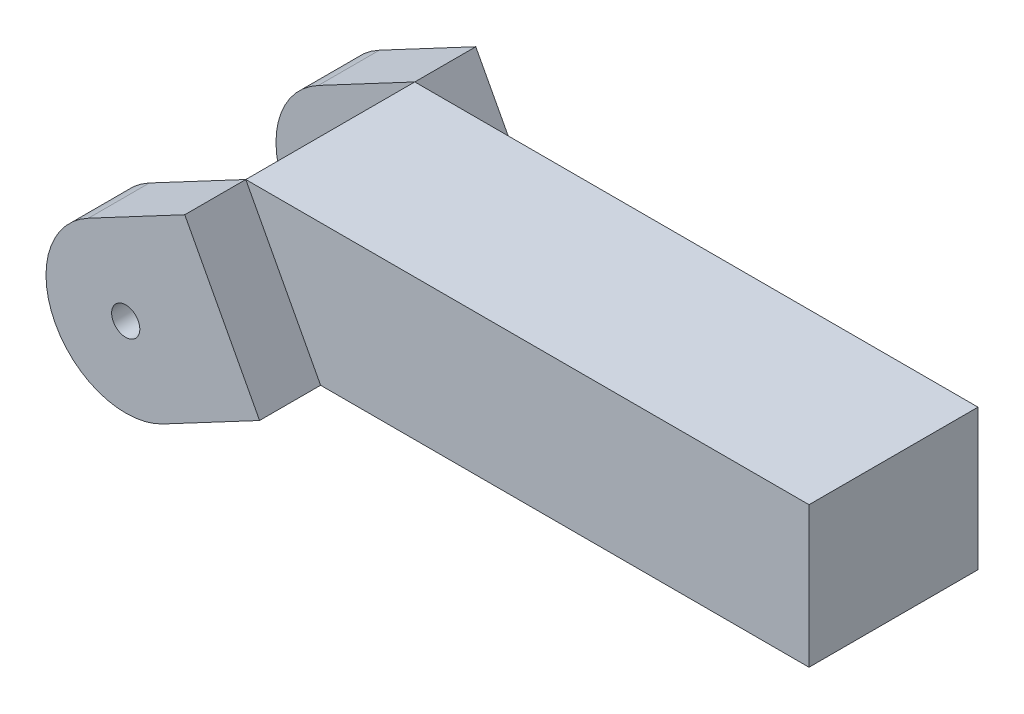
ISO-10303-21;
HEADER;
FILE_DESCRIPTION(('STEP AP214'),'2;1');
FILE_NAME('part.step','',(''),(''),'','','');
FILE_SCHEMA(('AUTOMOTIVE_DESIGN { 1 0 10303 214 1 1 1 1 }'));
ENDSEC;
DATA;
#1=APPLICATION_CONTEXT('core data for automotive mechanical design processes');
#2=APPLICATION_PROTOCOL_DEFINITION('international standard','automotive_design',2000,#1);
#3=PRODUCT_CONTEXT('',#1,'mechanical');
#4=PRODUCT('Part','Part','',(#3));
#5=PRODUCT_RELATED_PRODUCT_CATEGORY('part','',(#4));
#6=PRODUCT_DEFINITION_FORMATION('','',#4);
#7=PRODUCT_DEFINITION_CONTEXT('part definition',#1,'design');
#8=PRODUCT_DEFINITION('design','',#6,#7);
#9=PRODUCT_DEFINITION_SHAPE('','',#8);
#10=(LENGTH_UNIT() NAMED_UNIT(*) SI_UNIT(.MILLI.,.METRE.));
#11=(NAMED_UNIT(*) PLANE_ANGLE_UNIT() SI_UNIT($,.RADIAN.));
#12=(NAMED_UNIT(*) SI_UNIT($,.STERADIAN.) SOLID_ANGLE_UNIT());
#13=UNCERTAINTY_MEASURE_WITH_UNIT(LENGTH_MEASURE(1.E-05),#10,'distance_accuracy_value','');
#14=(GEOMETRIC_REPRESENTATION_CONTEXT(3) GLOBAL_UNCERTAINTY_ASSIGNED_CONTEXT((#13)) GLOBAL_UNIT_ASSIGNED_CONTEXT((#10,
#11,#12)) REPRESENTATION_CONTEXT('',''));
#15=CARTESIAN_POINT('',(0.,0.,0.));
#16=DIRECTION('',(0.,0.,1.));
#17=DIRECTION('',(1.,0.,0.));
#18=AXIS2_PLACEMENT_3D('',#15,#16,#17);
#19=CARTESIAN_POINT('',(0.,0.,36.));
#20=DIRECTION('',(0.,0.,-1.));
#21=DIRECTION('',(1.,0.,0.));
#22=AXIS2_PLACEMENT_3D('',#19,#20,#21);
#23=PLANE('',#22);
#24=CARTESIAN_POINT('',(-72.5807082768003,-10.915949030261,36.));
#25=DIRECTION('',(0.,0.,1.));
#26=DIRECTION('',(1.,0.,0.));
#27=AXIS2_PLACEMENT_3D('',#24,#25,#26);
#28=CIRCLE('',#27,3.00000000000001);
#29=CARTESIAN_POINT('',(-69.5807082768003,-10.915949030261,36.));
#30=VERTEX_POINT('',#29);
#31=EDGE_CURVE('E114',#30,#30,#28,.F.);
#32=ORIENTED_EDGE('',*,*,#31,.F.);
#33=EDGE_LOOP('',(#32));
#34=FACE_BOUND('',#33,.T.);
#35=DIRECTION('',(-0.883127916837894,-0.46913226546632,0.));
#36=VECTOR('',#35,1.);
#37=CARTESIAN_POINT('',(-44.0635000936416,-15.,36.));
#38=LINE('',#37,#36);
#39=CARTESIAN_POINT('',(-44.0635000936416,-15.,36.));
#40=VERTEX_POINT('',#39);
#41=CARTESIAN_POINT('',(-64.6124583236211,-25.915949030261,36.));
#42=VERTEX_POINT('',#41);
#43=EDGE_CURVE('E111',#40,#42,#38,.T.);
#44=ORIENTED_EDGE('',*,*,#43,.T.);
#45=CARTESIAN_POINT('',(-72.5807082768003,-10.915949030261,36.));
#46=DIRECTION('',(0.,0.,1.));
#47=DIRECTION('',(1.,0.,0.));
#48=AXIS2_PLACEMENT_3D('',#45,#46,#47);
#49=CIRCLE('',#48,16.9850819049053);
#50=CARTESIAN_POINT('',(-80.5489582299795,4.08405096973898,36.));
#51=VERTEX_POINT('',#50);
#52=EDGE_CURVE('E105',#42,#51,#49,.F.);
#53=ORIENTED_EDGE('',*,*,#52,.T.);
#54=DIRECTION('',(0.883127916837894,0.46913226546632,0.));
#55=VECTOR('',#54,1.);
#56=CARTESIAN_POINT('',(-60.,15.,36.));
#57=LINE('',#56,#55);
#58=CARTESIAN_POINT('',(-60.,15.,36.));
#59=VERTEX_POINT('',#58);
#60=EDGE_CURVE('E103',#51,#59,#57,.T.);
#61=ORIENTED_EDGE('',*,*,#60,.T.);
#62=DIRECTION('',(0.46913226546632,-0.883127916837894,0.));
#63=VECTOR('',#62,1.);
#64=CARTESIAN_POINT('',(-60.,15.,36.));
#65=LINE('',#64,#63);
#66=EDGE_CURVE('E12',#59,#40,#65,.T.);
#67=ORIENTED_EDGE('',*,*,#66,.T.);
#68=EDGE_LOOP('',(#44,#53,#61,#67));
#69=FACE_BOUND('',#68,.T.);
#70=ADVANCED_FACE('F45',(#34,#69),#23,.T.);
#71=CARTESIAN_POINT('',(-60.,15.,-26.5376435321832));
#72=DIRECTION('',(-0.46913226546632,0.883127916837894,0.));
#73=DIRECTION('',(-0.883127916837894,-0.46913226546632,0.));
#74=AXIS2_PLACEMENT_3D('',#71,#72,#73);
#75=PLANE('',#74);
#76=DIRECTION('',(0.,0.,1.));
#77=VECTOR('',#76,1.);
#78=CARTESIAN_POINT('',(-80.5489582299795,4.08405096973897,-26.5376435321832));
#79=LINE('',#78,#77);
#80=CARTESIAN_POINT('',(-80.5489582299795,4.08405096973897,49.));
#81=VERTEX_POINT('',#80);
#82=EDGE_CURVE('E91',#51,#81,#79,.T.);
#83=ORIENTED_EDGE('',*,*,#82,.T.);
#84=DIRECTION('',(0.883127916837894,0.46913226546632,0.));
#85=VECTOR('',#84,1.);
#86=CARTESIAN_POINT('',(-60.,15.,49.));
#87=LINE('',#86,#85);
#88=CARTESIAN_POINT('',(-60.,15.,49.));
#89=VERTEX_POINT('',#88);
#90=EDGE_CURVE('E97',#81,#89,#87,.T.);
#91=ORIENTED_EDGE('',*,*,#90,.T.);
#92=DIRECTION('',(0.,0.,1.));
#93=VECTOR('',#92,1.);
#94=CARTESIAN_POINT('',(-60.,15.,-26.5376435321832));
#95=LINE('',#94,#93);
#96=EDGE_CURVE('E120',#59,#89,#95,.T.);
#97=ORIENTED_EDGE('',*,*,#96,.F.);
#98=ORIENTED_EDGE('',*,*,#60,.F.);
#99=EDGE_LOOP('',(#83,#91,#97,#98));
#100=FACE_BOUND('',#99,.T.);
#101=ADVANCED_FACE('F102',(#100),#75,.T.);
#102=CARTESIAN_POINT('',(-72.5807082768003,-10.915949030261,-26.5376435321832));
#103=DIRECTION('',(0.,0.,1.));
#104=DIRECTION('',(-1.,0.,0.));
#105=AXIS2_PLACEMENT_3D('',#102,#103,#104);
#106=CYLINDRICAL_SURFACE('',#105,16.9850819049053);
#107=DIRECTION('',(0.,0.,1.));
#108=VECTOR('',#107,1.);
#109=CARTESIAN_POINT('',(-64.6124583236211,-25.915949030261,-26.5376435321832));
#110=LINE('',#109,#108);
#111=CARTESIAN_POINT('',(-64.6124583236211,-25.915949030261,49.));
#112=VERTEX_POINT('',#111);
#113=EDGE_CURVE('E93',#42,#112,#110,.T.);
#114=ORIENTED_EDGE('',*,*,#113,.T.);
#115=CARTESIAN_POINT('',(-72.5807082768003,-10.915949030261,49.));
#116=DIRECTION('',(0.,0.,-1.));
#117=DIRECTION('',(-1.,0.,0.));
#118=AXIS2_PLACEMENT_3D('',#115,#116,#117);
#119=CIRCLE('',#118,16.9850819049053);
#120=EDGE_CURVE('E86',#112,#81,#119,.T.);
#121=ORIENTED_EDGE('',*,*,#120,.T.);
#122=ORIENTED_EDGE('',*,*,#82,.F.);
#123=ORIENTED_EDGE('',*,*,#52,.F.);
#124=EDGE_LOOP('',(#114,#121,#122,#123));
#125=FACE_BOUND('',#124,.T.);
#126=ADVANCED_FACE('F88',(#125),#106,.T.);
#127=CARTESIAN_POINT('',(-44.0635000936416,-15.,-26.5376435321832));
#128=DIRECTION('',(0.46913226546632,-0.883127916837894,0.));
#129=DIRECTION('',(0.883127916837894,0.46913226546632,0.));
#130=AXIS2_PLACEMENT_3D('',#127,#128,#129);
#131=PLANE('',#130);
#132=DIRECTION('',(0.,0.,1.));
#133=VECTOR('',#132,1.);
#134=CARTESIAN_POINT('',(-44.0635000936416,-15.,-26.5376435321832));
#135=LINE('',#134,#133);
#136=CARTESIAN_POINT('',(-44.0635000936416,-15.,49.));
#137=VERTEX_POINT('',#136);
#138=EDGE_CURVE('E95',#40,#137,#135,.T.);
#139=ORIENTED_EDGE('',*,*,#138,.T.);
#140=DIRECTION('',(-0.883127916837894,-0.46913226546632,0.));
#141=VECTOR('',#140,1.);
#142=CARTESIAN_POINT('',(-44.0635000936416,-15.,49.));
#143=LINE('',#142,#141);
#144=EDGE_CURVE('E81',#137,#112,#143,.T.);
#145=ORIENTED_EDGE('',*,*,#144,.T.);
#146=ORIENTED_EDGE('',*,*,#113,.F.);
#147=ORIENTED_EDGE('',*,*,#43,.F.);
#148=EDGE_LOOP('',(#139,#145,#146,#147));
#149=FACE_BOUND('',#148,.T.);
#150=ADVANCED_FACE('F123',(#149),#131,.T.);
#151=CARTESIAN_POINT('',(-60.,15.,-26.5376435321832));
#152=DIRECTION('',(0.883127916837894,0.46913226546632,0.));
#153=DIRECTION('',(-0.46913226546632,0.883127916837894,0.));
#154=AXIS2_PLACEMENT_3D('',#151,#152,#153);
#155=PLANE('',#154);
#156=ORIENTED_EDGE('',*,*,#96,.T.);
#157=DIRECTION('',(0.46913226546632,-0.883127916837894,0.));
#158=VECTOR('',#157,1.);
#159=CARTESIAN_POINT('',(-60.,15.,49.));
#160=LINE('',#159,#158);
#161=EDGE_CURVE('E98',#89,#137,#160,.T.);
#162=ORIENTED_EDGE('',*,*,#161,.T.);
#163=ORIENTED_EDGE('',*,*,#138,.F.);
#164=ORIENTED_EDGE('',*,*,#66,.F.);
#165=EDGE_LOOP('',(#156,#162,#163,#164));
#166=FACE_BOUND('',#165,.T.);
#167=ADVANCED_FACE('F125',(#166),#155,.T.);
#168=CARTESIAN_POINT('',(-72.5807082768003,-10.915949030261,-26.5376435321832));
#169=DIRECTION('',(0.,0.,1.));
#170=DIRECTION('',(-1.,0.,0.));
#171=AXIS2_PLACEMENT_3D('',#168,#169,#170);
#172=CYLINDRICAL_SURFACE('',#171,3.00000000000001);
#173=CARTESIAN_POINT('',(-72.5807082768003,-10.915949030261,49.));
#174=DIRECTION('',(0.,0.,-1.));
#175=DIRECTION('',(-1.,0.,0.));
#176=AXIS2_PLACEMENT_3D('',#173,#174,#175);
#177=CIRCLE('',#176,3.00000000000001);
#178=CARTESIAN_POINT('',(-75.5807082768003,-10.915949030261,49.));
#179=VERTEX_POINT('',#178);
#180=EDGE_CURVE('E54',#179,#179,#177,.T.);
#181=ORIENTED_EDGE('',*,*,#180,.F.);
#182=EDGE_LOOP('',(#181));
#183=FACE_BOUND('',#182,.T.);
#184=ORIENTED_EDGE('',*,*,#31,.T.);
#185=EDGE_LOOP('',(#184));
#186=FACE_BOUND('',#185,.T.);
#187=ADVANCED_FACE('F135',(#183,#186),#172,.F.);
#188=CARTESIAN_POINT('',(-72.5807082768003,-10.915949030261,49.));
#189=DIRECTION('',(0.,0.,1.));
#190=DIRECTION('',(-1.,0.,0.));
#191=AXIS2_PLACEMENT_3D('',#188,#189,#190);
#192=PLANE('',#191);
#193=ORIENTED_EDGE('',*,*,#180,.T.);
#194=EDGE_LOOP('',(#193));
#195=FACE_BOUND('',#194,.T.);
#196=ORIENTED_EDGE('',*,*,#90,.F.);
#197=ORIENTED_EDGE('',*,*,#120,.F.);
#198=ORIENTED_EDGE('',*,*,#144,.F.);
#199=ORIENTED_EDGE('',*,*,#161,.F.);
#200=EDGE_LOOP('',(#196,#197,#198,#199));
#201=FACE_BOUND('',#200,.T.);
#202=ADVANCED_FACE('F47',(#195,#201),#192,.T.);
#203=CLOSED_SHELL('',(#70,#101,#126,#150,#167,#187,#202));
#204=MANIFOLD_SOLID_BREP('B2',#203);
#205=CARTESIAN_POINT('',(0.,0.,0.));
#206=DIRECTION('',(0.,0.,1.));
#207=DIRECTION('',(1.,0.,0.));
#208=AXIS2_PLACEMENT_3D('',#205,#206,#207);
#209=PLANE('',#208);
#210=DIRECTION('',(-1.,0.,0.));
#211=VECTOR('',#210,1.);
#212=CARTESIAN_POINT('',(55.,-11.,0.));
#213=LINE('',#212,#211);
#214=CARTESIAN_POINT('',(55.,-11.,0.));
#215=VERTEX_POINT('',#214);
#216=CARTESIAN_POINT('',(14.,-11.,0.));
#217=VERTEX_POINT('',#216);
#218=EDGE_CURVE('E297',#215,#217,#213,.T.);
#219=ORIENTED_EDGE('',*,*,#218,.F.);
#220=DIRECTION('',(0.,-1.,0.));
#221=VECTOR('',#220,1.);
#222=CARTESIAN_POINT('',(55.,10.,0.));
#223=LINE('',#222,#221);
#224=CARTESIAN_POINT('',(55.,10.,0.));
#225=VERTEX_POINT('',#224);
#226=EDGE_CURVE('E263',#225,#215,#223,.T.);
#227=ORIENTED_EDGE('',*,*,#226,.F.);
#228=DIRECTION('',(-1.,0.,0.));
#229=VECTOR('',#228,1.);
#230=CARTESIAN_POINT('',(55.,10.,0.));
#231=LINE('',#230,#229);
#232=CARTESIAN_POINT('',(14.,10.,0.));
#233=VERTEX_POINT('',#232);
#234=EDGE_CURVE('E306',#225,#233,#231,.T.);
#235=ORIENTED_EDGE('',*,*,#234,.T.);
#236=DIRECTION('',(0.,-1.,0.));
#237=VECTOR('',#236,1.);
#238=CARTESIAN_POINT('',(14.,10.,0.));
#239=LINE('',#238,#237);
#240=EDGE_CURVE('E309',#233,#217,#239,.T.);
#241=ORIENTED_EDGE('',*,*,#240,.T.);
#242=EDGE_LOOP('',(#219,#227,#235,#241));
#243=FACE_BOUND('',#242,.T.);
#244=DIRECTION('',(0.46913226546632,-0.883127916837894,0.));
#245=VECTOR('',#244,1.);
#246=CARTESIAN_POINT('',(-60.,15.,0.));
#247=LINE('',#246,#245);
#248=CARTESIAN_POINT('',(-60.,15.,0.));
#249=VERTEX_POINT('',#248);
#250=CARTESIAN_POINT('',(-44.0635000936416,-15.,0.));
#251=VERTEX_POINT('',#250);
#252=EDGE_CURVE('E266',#249,#251,#247,.T.);
#253=ORIENTED_EDGE('',*,*,#252,.F.);
#254=DIRECTION('',(-1.,0.,0.));
#255=VECTOR('',#254,1.);
#256=CARTESIAN_POINT('',(-60.,15.,0.));
#257=LINE('',#256,#255);
#258=CARTESIAN_POINT('',(60.,15.,0.));
#259=VERTEX_POINT('',#258);
#260=EDGE_CURVE('E431',#259,#249,#257,.T.);
#261=ORIENTED_EDGE('',*,*,#260,.F.);
#262=DIRECTION('',(0.,1.,0.));
#263=VECTOR('',#262,1.);
#264=CARTESIAN_POINT('',(60.,15.,0.));
#265=LINE('',#264,#263);
#266=CARTESIAN_POINT('',(60.,-15.,0.));
#267=VERTEX_POINT('',#266);
#268=EDGE_CURVE('E292',#267,#259,#265,.T.);
#269=ORIENTED_EDGE('',*,*,#268,.F.);
#270=DIRECTION('',(1.,0.,0.));
#271=VECTOR('',#270,1.);
#272=CARTESIAN_POINT('',(-60.,-15.,0.));
#273=LINE('',#272,#271);
#274=EDGE_CURVE('E206',#251,#267,#273,.T.);
#275=ORIENTED_EDGE('',*,*,#274,.F.);
#276=EDGE_LOOP('',(#253,#261,#269,#275));
#277=FACE_BOUND('',#276,.T.);
#278=ADVANCED_FACE('F202',(#243,#277),#209,.F.);
#279=CARTESIAN_POINT('',(60.,15.,36.));
#280=DIRECTION('',(-1.,0.,0.));
#281=DIRECTION('',(0.,0.,1.));
#282=AXIS2_PLACEMENT_3D('',#279,#280,#281);
#283=PLANE('',#282);
#284=ORIENTED_EDGE('',*,*,#268,.T.);
#285=DIRECTION('',(0.,0.,-1.));
#286=VECTOR('',#285,1.);
#287=CARTESIAN_POINT('',(60.,15.,36.));
#288=LINE('',#287,#286);
#289=CARTESIAN_POINT('',(60.,15.,36.));
#290=VERTEX_POINT('',#289);
#291=EDGE_CURVE('E433',#290,#259,#288,.T.);
#292=ORIENTED_EDGE('',*,*,#291,.F.);
#293=DIRECTION('',(0.,1.,0.));
#294=VECTOR('',#293,1.);
#295=CARTESIAN_POINT('',(60.,15.,36.));
#296=LINE('',#295,#294);
#297=CARTESIAN_POINT('',(60.,-15.,36.));
#298=VERTEX_POINT('',#297);
#299=EDGE_CURVE('E287',#298,#290,#296,.T.);
#300=ORIENTED_EDGE('',*,*,#299,.F.);
#301=DIRECTION('',(0.,0.,-1.));
#302=VECTOR('',#301,1.);
#303=CARTESIAN_POINT('',(60.,-15.,36.));
#304=LINE('',#303,#302);
#305=EDGE_CURVE('E285',#298,#267,#304,.T.);
#306=ORIENTED_EDGE('',*,*,#305,.T.);
#307=EDGE_LOOP('',(#284,#292,#300,#306));
#308=FACE_BOUND('',#307,.T.);
#309=ADVANCED_FACE('F348',(#308),#283,.F.);
#310=CARTESIAN_POINT('',(-60.,15.,36.));
#311=DIRECTION('',(0.,-1.,0.));
#312=DIRECTION('',(0.,0.,-1.));
#313=AXIS2_PLACEMENT_3D('',#310,#311,#312);
#314=PLANE('',#313);
#315=ORIENTED_EDGE('',*,*,#260,.T.);
#316=DIRECTION('',(0.,0.,-1.));
#317=VECTOR('',#316,1.);
#318=CARTESIAN_POINT('',(-60.,15.,36.));
#319=LINE('',#318,#317);
#320=CARTESIAN_POINT('',(-60.,15.,36.));
#321=VERTEX_POINT('',#320);
#322=EDGE_CURVE('E43',#321,#249,#319,.T.);
#323=ORIENTED_EDGE('',*,*,#322,.F.);
#324=DIRECTION('',(-1.,0.,0.));
#325=VECTOR('',#324,1.);
#326=CARTESIAN_POINT('',(-60.,15.,36.));
#327=LINE('',#326,#325);
#328=EDGE_CURVE('E281',#290,#321,#327,.T.);
#329=ORIENTED_EDGE('',*,*,#328,.F.);
#330=ORIENTED_EDGE('',*,*,#291,.T.);
#331=EDGE_LOOP('',(#315,#323,#329,#330));
#332=FACE_BOUND('',#331,.T.);
#333=ADVANCED_FACE('F353',(#332),#314,.F.);
#334=CARTESIAN_POINT('',(-60.,-15.,36.));
#335=DIRECTION('',(0.,1.,0.));
#336=DIRECTION('',(0.,0.,1.));
#337=AXIS2_PLACEMENT_3D('',#334,#335,#336);
#338=PLANE('',#337);
#339=DIRECTION('',(1.,0.,0.));
#340=VECTOR('',#339,1.);
#341=CARTESIAN_POINT('',(-60.,-15.,36.));
#342=LINE('',#341,#340);
#343=CARTESIAN_POINT('',(-44.0635000936416,-15.,36.));
#344=VERTEX_POINT('',#343);
#345=EDGE_CURVE('E279',#344,#298,#342,.T.);
#346=ORIENTED_EDGE('',*,*,#345,.F.);
#347=DIRECTION('',(0.,0.,1.));
#348=VECTOR('',#347,1.);
#349=CARTESIAN_POINT('',(-44.0635000936416,-15.,0.));
#350=LINE('',#349,#348);
#351=EDGE_CURVE('E212',#251,#344,#350,.T.);
#352=ORIENTED_EDGE('',*,*,#351,.F.);
#353=ORIENTED_EDGE('',*,*,#274,.T.);
#354=ORIENTED_EDGE('',*,*,#305,.F.);
#355=EDGE_LOOP('',(#346,#352,#353,#354));
#356=FACE_BOUND('',#355,.T.);
#357=ADVANCED_FACE('F283',(#356),#338,.F.);
#358=CARTESIAN_POINT('',(0.,0.,36.));
#359=DIRECTION('',(0.,0.,1.));
#360=DIRECTION('',(1.,0.,0.));
#361=AXIS2_PLACEMENT_3D('',#358,#359,#360);
#362=PLANE('',#361);
#363=DIRECTION('',(0.46913226546632,-0.883127916837894,0.));
#364=VECTOR('',#363,1.);
#365=CARTESIAN_POINT('',(-66.5069893713645,27.2492192318246,36.));
#366=LINE('',#365,#364);
#367=EDGE_CURVE('E270',#321,#344,#366,.T.);
#368=ORIENTED_EDGE('',*,*,#367,.T.);
#369=ORIENTED_EDGE('',*,*,#345,.T.);
#370=ORIENTED_EDGE('',*,*,#299,.T.);
#371=ORIENTED_EDGE('',*,*,#328,.T.);
#372=EDGE_LOOP('',(#368,#369,#370,#371));
#373=FACE_BOUND('',#372,.T.);
#374=ADVANCED_FACE('F277',(#373),#362,.T.);
#375=CARTESIAN_POINT('',(55.,10.,30.));
#376=DIRECTION('',(1.,0.,0.));
#377=DIRECTION('',(0.,0.,-1.));
#378=AXIS2_PLACEMENT_3D('',#375,#376,#377);
#379=PLANE('',#378);
#380=ORIENTED_EDGE('',*,*,#226,.T.);
#381=DIRECTION('',(0.,0.,-1.));
#382=VECTOR('',#381,1.);
#383=CARTESIAN_POINT('',(55.,-11.,30.));
#384=LINE('',#383,#382);
#385=CARTESIAN_POINT('',(55.,-11.,30.));
#386=VERTEX_POINT('',#385);
#387=EDGE_CURVE('E260',#386,#215,#384,.T.);
#388=ORIENTED_EDGE('',*,*,#387,.F.);
#389=DIRECTION('',(0.,-1.,0.));
#390=VECTOR('',#389,1.);
#391=CARTESIAN_POINT('',(55.,10.,30.));
#392=LINE('',#391,#390);
#393=CARTESIAN_POINT('',(55.,10.,30.));
#394=VERTEX_POINT('',#393);
#395=EDGE_CURVE('E296',#394,#386,#392,.T.);
#396=ORIENTED_EDGE('',*,*,#395,.F.);
#397=DIRECTION('',(0.,0.,-1.));
#398=VECTOR('',#397,1.);
#399=CARTESIAN_POINT('',(55.,10.,30.));
#400=LINE('',#399,#398);
#401=EDGE_CURVE('E304',#394,#225,#400,.T.);
#402=ORIENTED_EDGE('',*,*,#401,.T.);
#403=EDGE_LOOP('',(#380,#388,#396,#402));
#404=FACE_BOUND('',#403,.T.);
#405=ADVANCED_FACE('F325',(#404),#379,.F.);
#406=CARTESIAN_POINT('',(55.,10.,30.));
#407=DIRECTION('',(0.,-1.,0.));
#408=DIRECTION('',(0.,0.,-1.));
#409=AXIS2_PLACEMENT_3D('',#406,#407,#408);
#410=PLANE('',#409);
#411=ORIENTED_EDGE('',*,*,#234,.F.);
#412=ORIENTED_EDGE('',*,*,#401,.F.);
#413=DIRECTION('',(-1.,0.,0.));
#414=VECTOR('',#413,1.);
#415=CARTESIAN_POINT('',(55.,10.,30.));
#416=LINE('',#415,#414);
#417=CARTESIAN_POINT('',(14.,10.,30.));
#418=VERTEX_POINT('',#417);
#419=EDGE_CURVE('E303',#394,#418,#416,.T.);
#420=ORIENTED_EDGE('',*,*,#419,.T.);
#421=DIRECTION('',(0.,0.,-1.));
#422=VECTOR('',#421,1.);
#423=CARTESIAN_POINT('',(14.,10.,30.));
#424=LINE('',#423,#422);
#425=EDGE_CURVE('E301',#418,#233,#424,.T.);
#426=ORIENTED_EDGE('',*,*,#425,.T.);
#427=EDGE_LOOP('',(#411,#412,#420,#426));
#428=FACE_BOUND('',#427,.T.);
#429=ADVANCED_FACE('F328',(#428),#410,.T.);
#430=CARTESIAN_POINT('',(14.,10.,30.));
#431=DIRECTION('',(1.,0.,0.));
#432=DIRECTION('',(0.,0.,-1.));
#433=AXIS2_PLACEMENT_3D('',#430,#431,#432);
#434=PLANE('',#433);
#435=ORIENTED_EDGE('',*,*,#240,.F.);
#436=ORIENTED_EDGE('',*,*,#425,.F.);
#437=DIRECTION('',(0.,-1.,0.));
#438=VECTOR('',#437,1.);
#439=CARTESIAN_POINT('',(14.,10.,30.));
#440=LINE('',#439,#438);
#441=CARTESIAN_POINT('',(14.,-11.,30.));
#442=VERTEX_POINT('',#441);
#443=EDGE_CURVE('E300',#418,#442,#440,.T.);
#444=ORIENTED_EDGE('',*,*,#443,.T.);
#445=DIRECTION('',(0.,0.,-1.));
#446=VECTOR('',#445,1.);
#447=CARTESIAN_POINT('',(14.,-11.,30.));
#448=LINE('',#447,#446);
#449=EDGE_CURVE('E298',#442,#217,#448,.T.);
#450=ORIENTED_EDGE('',*,*,#449,.T.);
#451=EDGE_LOOP('',(#435,#436,#444,#450));
#452=FACE_BOUND('',#451,.T.);
#453=ADVANCED_FACE('F338',(#452),#434,.T.);
#454=CARTESIAN_POINT('',(55.,-11.,30.));
#455=DIRECTION('',(0.,-1.,0.));
#456=DIRECTION('',(0.,0.,-1.));
#457=AXIS2_PLACEMENT_3D('',#454,#455,#456);
#458=PLANE('',#457);
#459=ORIENTED_EDGE('',*,*,#218,.T.);
#460=ORIENTED_EDGE('',*,*,#449,.F.);
#461=DIRECTION('',(-1.,0.,0.));
#462=VECTOR('',#461,1.);
#463=CARTESIAN_POINT('',(55.,-11.,30.));
#464=LINE('',#463,#462);
#465=EDGE_CURVE('E317',#386,#442,#464,.T.);
#466=ORIENTED_EDGE('',*,*,#465,.F.);
#467=ORIENTED_EDGE('',*,*,#387,.T.);
#468=EDGE_LOOP('',(#459,#460,#466,#467));
#469=FACE_BOUND('',#468,.T.);
#470=ADVANCED_FACE('F336',(#469),#458,.F.);
#471=CARTESIAN_POINT('',(0.,0.,30.));
#472=DIRECTION('',(0.,0.,-1.));
#473=DIRECTION('',(-1.,0.,0.));
#474=AXIS2_PLACEMENT_3D('',#471,#472,#473);
#475=PLANE('',#474);
#476=ORIENTED_EDGE('',*,*,#395,.T.);
#477=ORIENTED_EDGE('',*,*,#465,.T.);
#478=ORIENTED_EDGE('',*,*,#443,.F.);
#479=ORIENTED_EDGE('',*,*,#419,.F.);
#480=EDGE_LOOP('',(#476,#477,#478,#479));
#481=FACE_BOUND('',#480,.T.);
#482=ADVANCED_FACE('F323',(#481),#475,.T.);
#483=CARTESIAN_POINT('',(-66.5069893713645,27.2492192318246,0.));
#484=DIRECTION('',(0.883127916837894,0.46913226546632,0.));
#485=DIRECTION('',(-0.46913226546632,0.883127916837894,0.));
#486=AXIS2_PLACEMENT_3D('',#483,#484,#485);
#487=PLANE('',#486);
#488=ORIENTED_EDGE('',*,*,#252,.T.);
#489=ORIENTED_EDGE('',*,*,#351,.T.);
#490=ORIENTED_EDGE('',*,*,#367,.F.);
#491=ORIENTED_EDGE('',*,*,#322,.T.);
#492=EDGE_LOOP('',(#488,#489,#490,#491));
#493=FACE_BOUND('',#492,.T.);
#494=ADVANCED_FACE('F204',(#493),#487,.F.);
#495=CLOSED_SHELL('',(#278,#309,#333,#357,#374,#405,#429,#453,#470,#482,#494));
#496=MANIFOLD_SOLID_BREP('B6',#495);
#497=CARTESIAN_POINT('',(0.,0.,6.));
#498=DIRECTION('',(0.,0.,1.));
#499=DIRECTION('',(-1.,0.,0.));
#500=AXIS2_PLACEMENT_3D('',#497,#498,#499);
#501=PLANE('',#500);
#502=DIRECTION('',(0.,-1.,0.));
#503=VECTOR('',#502,1.);
#504=CARTESIAN_POINT('',(55.,10.,6.));
#505=LINE('',#504,#503);
#506=CARTESIAN_POINT('',(55.,10.,6.));
#507=VERTEX_POINT('',#506);
#508=CARTESIAN_POINT('',(55.,-11.,6.));
#509=VERTEX_POINT('',#508);
#510=EDGE_CURVE('E603',#507,#509,#505,.T.);
#511=ORIENTED_EDGE('',*,*,#510,.F.);
#512=DIRECTION('',(-1.,0.,0.));
#513=VECTOR('',#512,1.);
#514=CARTESIAN_POINT('',(55.,10.,6.));
#515=LINE('',#514,#513);
#516=CARTESIAN_POINT('',(14.,10.,6.));
#517=VERTEX_POINT('',#516);
#518=EDGE_CURVE('E615',#507,#517,#515,.T.);
#519=ORIENTED_EDGE('',*,*,#518,.T.);
#520=DIRECTION('',(0.,-1.,0.));
#521=VECTOR('',#520,1.);
#522=CARTESIAN_POINT('',(14.,10.,6.));
#523=LINE('',#522,#521);
#524=CARTESIAN_POINT('',(14.,-11.,6.));
#525=VERTEX_POINT('',#524);
#526=EDGE_CURVE('E617',#517,#525,#523,.T.);
#527=ORIENTED_EDGE('',*,*,#526,.T.);
#528=DIRECTION('',(-1.,0.,0.));
#529=VECTOR('',#528,1.);
#530=CARTESIAN_POINT('',(55.,-11.,6.));
#531=LINE('',#530,#529);
#532=EDGE_CURVE('E605',#509,#525,#531,.T.);
#533=ORIENTED_EDGE('',*,*,#532,.F.);
#534=EDGE_LOOP('',(#511,#519,#527,#533));
#535=FACE_BOUND('',#534,.T.);
#536=ADVANCED_FACE('F449',(#535),#501,.T.);
#537=CARTESIAN_POINT('',(60.,15.,0.));
#538=DIRECTION('',(-1.,0.,0.));
#539=DIRECTION('',(0.,0.,-1.));
#540=AXIS2_PLACEMENT_3D('',#537,#538,#539);
#541=PLANE('',#540);
#542=DIRECTION('',(0.,1.,0.));
#543=VECTOR('',#542,1.);
#544=CARTESIAN_POINT('',(60.,15.,36.));
#545=LINE('',#544,#543);
#546=CARTESIAN_POINT('',(60.,-15.,36.));
#547=VERTEX_POINT('',#546);
#548=CARTESIAN_POINT('',(60.,15.,36.));
#549=VERTEX_POINT('',#548);
#550=EDGE_CURVE('E543',#547,#549,#545,.T.);
#551=ORIENTED_EDGE('',*,*,#550,.F.);
#552=DIRECTION('',(0.,0.,1.));
#553=VECTOR('',#552,1.);
#554=CARTESIAN_POINT('',(60.,-15.,0.));
#555=LINE('',#554,#553);
#556=CARTESIAN_POINT('',(60.,-15.,0.));
#557=VERTEX_POINT('',#556);
#558=EDGE_CURVE('E536',#557,#547,#555,.T.);
#559=ORIENTED_EDGE('',*,*,#558,.F.);
#560=DIRECTION('',(0.,1.,0.));
#561=VECTOR('',#560,1.);
#562=CARTESIAN_POINT('',(60.,15.,0.));
#563=LINE('',#562,#561);
#564=CARTESIAN_POINT('',(60.,15.,0.));
#565=VERTEX_POINT('',#564);
#566=EDGE_CURVE('E534',#557,#565,#563,.T.);
#567=ORIENTED_EDGE('',*,*,#566,.T.);
#568=DIRECTION('',(0.,0.,1.));
#569=VECTOR('',#568,1.);
#570=CARTESIAN_POINT('',(60.,15.,0.));
#571=LINE('',#570,#569);
#572=EDGE_CURVE('E453',#565,#549,#571,.T.);
#573=ORIENTED_EDGE('',*,*,#572,.T.);
#574=EDGE_LOOP('',(#551,#559,#567,#573));
#575=FACE_BOUND('',#574,.T.);
#576=ADVANCED_FACE('F451',(#575),#541,.F.);
#577=CARTESIAN_POINT('',(55.,10.,6.));
#578=DIRECTION('',(1.,0.,0.));
#579=DIRECTION('',(0.,0.,1.));
#580=AXIS2_PLACEMENT_3D('',#577,#578,#579);
#581=PLANE('',#580);
#582=DIRECTION('',(0.,-1.,0.));
#583=VECTOR('',#582,1.);
#584=CARTESIAN_POINT('',(55.,10.,36.));
#585=LINE('',#584,#583);
#586=CARTESIAN_POINT('',(55.,10.,36.));
#587=VERTEX_POINT('',#586);
#588=CARTESIAN_POINT('',(55.,-11.,36.));
#589=VERTEX_POINT('',#588);
#590=EDGE_CURVE('E523',#587,#589,#585,.T.);
#591=ORIENTED_EDGE('',*,*,#590,.F.);
#592=DIRECTION('',(0.,0.,1.));
#593=VECTOR('',#592,1.);
#594=CARTESIAN_POINT('',(55.,10.,6.));
#595=LINE('',#594,#593);
#596=EDGE_CURVE('E547',#507,#587,#595,.T.);
#597=ORIENTED_EDGE('',*,*,#596,.F.);
#598=ORIENTED_EDGE('',*,*,#510,.T.);
#599=DIRECTION('',(0.,0.,1.));
#600=VECTOR('',#599,1.);
#601=CARTESIAN_POINT('',(55.,-11.,6.));
#602=LINE('',#601,#600);
#603=EDGE_CURVE('E471',#509,#589,#602,.T.);
#604=ORIENTED_EDGE('',*,*,#603,.T.);
#605=EDGE_LOOP('',(#591,#597,#598,#604));
#606=FACE_BOUND('',#605,.T.);
#607=ADVANCED_FACE('F574',(#606),#581,.F.);
#608=CARTESIAN_POINT('',(55.,10.,6.));
#609=DIRECTION('',(0.,-1.,0.));
#610=DIRECTION('',(0.,0.,1.));
#611=AXIS2_PLACEMENT_3D('',#608,#609,#610);
#612=PLANE('',#611);
#613=DIRECTION('',(-1.,0.,0.));
#614=VECTOR('',#613,1.);
#615=CARTESIAN_POINT('',(55.,10.,36.));
#616=LINE('',#615,#614);
#617=CARTESIAN_POINT('',(14.,10.,36.));
#618=VERTEX_POINT('',#617);
#619=EDGE_CURVE('E599',#587,#618,#616,.T.);
#620=ORIENTED_EDGE('',*,*,#619,.T.);
#621=DIRECTION('',(0.,0.,1.));
#622=VECTOR('',#621,1.);
#623=CARTESIAN_POINT('',(14.,10.,6.));
#624=LINE('',#623,#622);
#625=EDGE_CURVE('E611',#517,#618,#624,.T.);
#626=ORIENTED_EDGE('',*,*,#625,.F.);
#627=ORIENTED_EDGE('',*,*,#518,.F.);
#628=ORIENTED_EDGE('',*,*,#596,.T.);
#629=EDGE_LOOP('',(#620,#626,#627,#628));
#630=FACE_BOUND('',#629,.T.);
#631=ADVANCED_FACE('F578',(#630),#612,.T.);
#632=CARTESIAN_POINT('',(14.,10.,6.));
#633=DIRECTION('',(1.,0.,0.));
#634=DIRECTION('',(0.,0.,1.));
#635=AXIS2_PLACEMENT_3D('',#632,#633,#634);
#636=PLANE('',#635);
#637=DIRECTION('',(0.,-1.,0.));
#638=VECTOR('',#637,1.);
#639=CARTESIAN_POINT('',(14.,10.,36.));
#640=LINE('',#639,#638);
#641=CARTESIAN_POINT('',(14.,-11.,36.));
#642=VERTEX_POINT('',#641);
#643=EDGE_CURVE('E601',#618,#642,#640,.T.);
#644=ORIENTED_EDGE('',*,*,#643,.T.);
#645=DIRECTION('',(0.,0.,1.));
#646=VECTOR('',#645,1.);
#647=CARTESIAN_POINT('',(14.,-11.,6.));
#648=LINE('',#647,#646);
#649=EDGE_CURVE('E613',#525,#642,#648,.T.);
#650=ORIENTED_EDGE('',*,*,#649,.F.);
#651=ORIENTED_EDGE('',*,*,#526,.F.);
#652=ORIENTED_EDGE('',*,*,#625,.T.);
#653=EDGE_LOOP('',(#644,#650,#651,#652));
#654=FACE_BOUND('',#653,.T.);
#655=ADVANCED_FACE('F581',(#654),#636,.T.);
#656=CARTESIAN_POINT('',(55.,-11.,6.));
#657=DIRECTION('',(0.,-1.,0.));
#658=DIRECTION('',(0.,0.,1.));
#659=AXIS2_PLACEMENT_3D('',#656,#657,#658);
#660=PLANE('',#659);
#661=DIRECTION('',(-1.,0.,0.));
#662=VECTOR('',#661,1.);
#663=CARTESIAN_POINT('',(55.,-11.,36.));
#664=LINE('',#663,#662);
#665=EDGE_CURVE('E595',#589,#642,#664,.T.);
#666=ORIENTED_EDGE('',*,*,#665,.F.);
#667=ORIENTED_EDGE('',*,*,#603,.F.);
#668=ORIENTED_EDGE('',*,*,#532,.T.);
#669=ORIENTED_EDGE('',*,*,#649,.T.);
#670=EDGE_LOOP('',(#666,#667,#668,#669));
#671=FACE_BOUND('',#670,.T.);
#672=ADVANCED_FACE('F565',(#671),#660,.F.);
#673=CARTESIAN_POINT('',(0.,0.,0.));
#674=DIRECTION('',(0.,0.,-1.));
#675=DIRECTION('',(1.,0.,0.));
#676=AXIS2_PLACEMENT_3D('',#673,#674,#675);
#677=PLANE('',#676);
#678=DIRECTION('',(0.46913226546632,-0.883127916837894,0.));
#679=VECTOR('',#678,1.);
#680=CARTESIAN_POINT('',(-66.5069893713645,27.2492192318246,0.));
#681=LINE('',#680,#679);
#682=CARTESIAN_POINT('',(-60.,15.,0.));
#683=VERTEX_POINT('',#682);
#684=CARTESIAN_POINT('',(-44.0635000936416,-15.,0.));
#685=VERTEX_POINT('',#684);
#686=EDGE_CURVE('E513',#683,#685,#681,.T.);
#687=ORIENTED_EDGE('',*,*,#686,.F.);
#688=DIRECTION('',(-1.,0.,0.));
#689=VECTOR('',#688,1.);
#690=CARTESIAN_POINT('',(-60.,15.,0.));
#691=LINE('',#690,#689);
#692=EDGE_CURVE('E537',#565,#683,#691,.T.);
#693=ORIENTED_EDGE('',*,*,#692,.F.);
#694=ORIENTED_EDGE('',*,*,#566,.F.);
#695=DIRECTION('',(1.,0.,0.));
#696=VECTOR('',#695,1.);
#697=CARTESIAN_POINT('',(-60.,-15.,0.));
#698=LINE('',#697,#696);
#699=EDGE_CURVE('E527',#685,#557,#698,.T.);
#700=ORIENTED_EDGE('',*,*,#699,.F.);
#701=EDGE_LOOP('',(#687,#693,#694,#700));
#702=FACE_BOUND('',#701,.T.);
#703=ADVANCED_FACE('F532',(#702),#677,.T.);
#704=CARTESIAN_POINT('',(0.,0.,36.));
#705=DIRECTION('',(0.,0.,-1.));
#706=DIRECTION('',(1.,0.,0.));
#707=AXIS2_PLACEMENT_3D('',#704,#705,#706);
#708=PLANE('',#707);
#709=ORIENTED_EDGE('',*,*,#665,.T.);
#710=ORIENTED_EDGE('',*,*,#643,.F.);
#711=ORIENTED_EDGE('',*,*,#619,.F.);
#712=ORIENTED_EDGE('',*,*,#590,.T.);
#713=EDGE_LOOP('',(#709,#710,#711,#712));
#714=FACE_BOUND('',#713,.T.);
#715=DIRECTION('',(0.46913226546632,-0.883127916837894,0.));
#716=VECTOR('',#715,1.);
#717=CARTESIAN_POINT('',(-60.,15.,36.));
#718=LINE('',#717,#716);
#719=CARTESIAN_POINT('',(-60.,15.,36.));
#720=VERTEX_POINT('',#719);
#721=CARTESIAN_POINT('',(-44.0635000936416,-15.,36.));
#722=VERTEX_POINT('',#721);
#723=EDGE_CURVE('E200',#720,#722,#718,.T.);
#724=ORIENTED_EDGE('',*,*,#723,.T.);
#725=DIRECTION('',(1.,0.,0.));
#726=VECTOR('',#725,1.);
#727=CARTESIAN_POINT('',(-60.,-15.,36.));
#728=LINE('',#727,#726);
#729=EDGE_CURVE('E530',#722,#547,#728,.T.);
#730=ORIENTED_EDGE('',*,*,#729,.T.);
#731=ORIENTED_EDGE('',*,*,#550,.T.);
#732=DIRECTION('',(-1.,0.,0.));
#733=VECTOR('',#732,1.);
#734=CARTESIAN_POINT('',(-60.,15.,36.));
#735=LINE('',#734,#733);
#736=EDGE_CURVE('E546',#549,#720,#735,.T.);
#737=ORIENTED_EDGE('',*,*,#736,.T.);
#738=EDGE_LOOP('',(#724,#730,#731,#737));
#739=FACE_BOUND('',#738,.T.);
#740=ADVANCED_FACE('F556',(#714,#739),#708,.F.);
#741=CARTESIAN_POINT('',(-60.,-15.,0.));
#742=DIRECTION('',(0.,1.,0.));
#743=DIRECTION('',(0.,0.,-1.));
#744=AXIS2_PLACEMENT_3D('',#741,#742,#743);
#745=PLANE('',#744);
#746=ORIENTED_EDGE('',*,*,#729,.F.);
#747=DIRECTION('',(0.,0.,1.));
#748=VECTOR('',#747,1.);
#749=CARTESIAN_POINT('',(-44.0635000936416,-15.,0.));
#750=LINE('',#749,#748);
#751=EDGE_CURVE('E516',#685,#722,#750,.T.);
#752=ORIENTED_EDGE('',*,*,#751,.F.);
#753=ORIENTED_EDGE('',*,*,#699,.T.);
#754=ORIENTED_EDGE('',*,*,#558,.T.);
#755=EDGE_LOOP('',(#746,#752,#753,#754));
#756=FACE_BOUND('',#755,.T.);
#757=ADVANCED_FACE('F526',(#756),#745,.F.);
#758=CARTESIAN_POINT('',(-60.,15.,0.));
#759=DIRECTION('',(0.,-1.,0.));
#760=DIRECTION('',(0.,0.,1.));
#761=AXIS2_PLACEMENT_3D('',#758,#759,#760);
#762=PLANE('',#761);
#763=ORIENTED_EDGE('',*,*,#736,.F.);
#764=ORIENTED_EDGE('',*,*,#572,.F.);
#765=ORIENTED_EDGE('',*,*,#692,.T.);
#766=DIRECTION('',(0.,0.,1.));
#767=VECTOR('',#766,1.);
#768=CARTESIAN_POINT('',(-60.,15.,0.));
#769=LINE('',#768,#767);
#770=EDGE_CURVE('E519',#683,#720,#769,.T.);
#771=ORIENTED_EDGE('',*,*,#770,.T.);
#772=EDGE_LOOP('',(#763,#764,#765,#771));
#773=FACE_BOUND('',#772,.T.);
#774=ADVANCED_FACE('F554',(#773),#762,.F.);
#775=CARTESIAN_POINT('',(-66.5069893713645,27.2492192318246,0.));
#776=DIRECTION('',(0.883127916837894,0.46913226546632,0.));
#777=DIRECTION('',(-0.46913226546632,0.883127916837894,0.));
#778=AXIS2_PLACEMENT_3D('',#775,#776,#777);
#779=PLANE('',#778);
#780=ORIENTED_EDGE('',*,*,#686,.T.);
#781=ORIENTED_EDGE('',*,*,#751,.T.);
#782=ORIENTED_EDGE('',*,*,#723,.F.);
#783=ORIENTED_EDGE('',*,*,#770,.F.);
#784=EDGE_LOOP('',(#780,#781,#782,#783));
#785=FACE_BOUND('',#784,.T.);
#786=ADVANCED_FACE('F515',(#785),#779,.F.);
#787=CLOSED_SHELL('',(#536,#576,#607,#631,#655,#672,#703,#740,#757,#774,#786));
#788=MANIFOLD_SOLID_BREP('B37',#787);
#789=CARTESIAN_POINT('',(-72.5807082768003,-10.915949030261,62.5376435321832));
#790=DIRECTION('',(0.,0.,-1.));
#791=DIRECTION('',(-1.,0.,0.));
#792=AXIS2_PLACEMENT_3D('',#789,#790,#791);
#793=CYLINDRICAL_SURFACE('',#792,16.9850819049053);
#794=DIRECTION('',(0.,0.,-1.));
#795=VECTOR('',#794,1.);
#796=CARTESIAN_POINT('',(-64.6124583236211,-25.915949030261,62.5376435321832));
#797=LINE('',#796,#795);
#798=CARTESIAN_POINT('',(-64.6124583236211,-25.915949030261,0.));
#799=VERTEX_POINT('',#798);
#800=CARTESIAN_POINT('',(-64.6124583236211,-25.915949030261,-13.));
#801=VERTEX_POINT('',#800);
#802=EDGE_CURVE('E741',#799,#801,#797,.T.);
#803=ORIENTED_EDGE('',*,*,#802,.F.);
#804=CARTESIAN_POINT('',(-72.5807082768003,-10.915949030261,0.));
#805=DIRECTION('',(0.,0.,1.));
#806=DIRECTION('',(1.,0.,0.));
#807=AXIS2_PLACEMENT_3D('',#804,#805,#806);
#808=CIRCLE('',#807,16.9850819049053);
#809=CARTESIAN_POINT('',(-80.5489582299795,4.08405096973898,0.));
#810=VERTEX_POINT('',#809);
#811=EDGE_CURVE('E728',#799,#810,#808,.F.);
#812=ORIENTED_EDGE('',*,*,#811,.T.);
#813=DIRECTION('',(0.,0.,-1.));
#814=VECTOR('',#813,1.);
#815=CARTESIAN_POINT('',(-80.5489582299795,4.08405096973897,62.5376435321832));
#816=LINE('',#815,#814);
#817=CARTESIAN_POINT('',(-80.5489582299795,4.08405096973897,-13.));
#818=VERTEX_POINT('',#817);
#819=EDGE_CURVE('E733',#810,#818,#816,.T.);
#820=ORIENTED_EDGE('',*,*,#819,.T.);
#821=CARTESIAN_POINT('',(-72.5807082768003,-10.915949030261,-13.));
#822=DIRECTION('',(0.,0.,-1.));
#823=DIRECTION('',(-1.,0.,0.));
#824=AXIS2_PLACEMENT_3D('',#821,#822,#823);
#825=CIRCLE('',#824,16.9850819049053);
#826=EDGE_CURVE('E759',#801,#818,#825,.T.);
#827=ORIENTED_EDGE('',*,*,#826,.F.);
#828=EDGE_LOOP('',(#803,#812,#820,#827));
#829=FACE_BOUND('',#828,.T.);
#830=ADVANCED_FACE('F687',(#829),#793,.T.);
#831=CARTESIAN_POINT('',(-72.5807082768003,-10.915949030261,62.5376435321832));
#832=DIRECTION('',(0.,0.,-1.));
#833=DIRECTION('',(-1.,0.,0.));
#834=AXIS2_PLACEMENT_3D('',#831,#832,#833);
#835=CYLINDRICAL_SURFACE('',#834,3.00000000000001);
#836=CARTESIAN_POINT('',(-72.5807082768003,-10.915949030261,-13.));
#837=DIRECTION('',(0.,0.,-1.));
#838=DIRECTION('',(-1.,0.,0.));
#839=AXIS2_PLACEMENT_3D('',#836,#837,#838);
#840=CIRCLE('',#839,3.00000000000001);
#841=CARTESIAN_POINT('',(-75.5807082768003,-10.915949030261,-13.));
#842=VERTEX_POINT('',#841);
#843=EDGE_CURVE('E746',#842,#842,#840,.T.);
#844=ORIENTED_EDGE('',*,*,#843,.T.);
#845=EDGE_LOOP('',(#844));
#846=FACE_BOUND('',#845,.T.);
#847=CARTESIAN_POINT('',(-72.5807082768003,-10.915949030261,0.));
#848=DIRECTION('',(0.,0.,1.));
#849=DIRECTION('',(1.,0.,0.));
#850=AXIS2_PLACEMENT_3D('',#847,#848,#849);
#851=CIRCLE('',#850,3.00000000000001);
#852=CARTESIAN_POINT('',(-69.5807082768003,-10.915949030261,0.));
#853=VERTEX_POINT('',#852);
#854=EDGE_CURVE('E696',#853,#853,#851,.F.);
#855=ORIENTED_EDGE('',*,*,#854,.F.);
#856=EDGE_LOOP('',(#855));
#857=FACE_BOUND('',#856,.T.);
#858=ADVANCED_FACE('F780',(#846,#857),#835,.F.);
#859=CARTESIAN_POINT('',(0.,0.,0.));
#860=DIRECTION('',(0.,0.,1.));
#861=DIRECTION('',(1.,0.,0.));
#862=AXIS2_PLACEMENT_3D('',#859,#860,#861);
#863=PLANE('',#862);
#864=ORIENTED_EDGE('',*,*,#854,.T.);
#865=EDGE_LOOP('',(#864));
#866=FACE_BOUND('',#865,.T.);
#867=DIRECTION('',(0.883127916837894,0.46913226546632,0.));
#868=VECTOR('',#867,1.);
#869=CARTESIAN_POINT('',(-60.,15.,0.));
#870=LINE('',#869,#868);
#871=CARTESIAN_POINT('',(-60.,15.,0.));
#872=VERTEX_POINT('',#871);
#873=EDGE_CURVE('E725',#810,#872,#870,.T.);
#874=ORIENTED_EDGE('',*,*,#873,.F.);
#875=ORIENTED_EDGE('',*,*,#811,.F.);
#876=DIRECTION('',(-0.883127916837894,-0.46913226546632,0.));
#877=VECTOR('',#876,1.);
#878=CARTESIAN_POINT('',(-44.0635000936416,-15.,0.));
#879=LINE('',#878,#877);
#880=CARTESIAN_POINT('',(-44.0635000936416,-15.,0.));
#881=VERTEX_POINT('',#880);
#882=EDGE_CURVE('E708',#881,#799,#879,.T.);
#883=ORIENTED_EDGE('',*,*,#882,.F.);
#884=DIRECTION('',(0.46913226546632,-0.883127916837894,0.));
#885=VECTOR('',#884,1.);
#886=CARTESIAN_POINT('',(-60.,15.,0.));
#887=LINE('',#886,#885);
#888=EDGE_CURVE('E447',#872,#881,#887,.T.);
#889=ORIENTED_EDGE('',*,*,#888,.F.);
#890=EDGE_LOOP('',(#874,#875,#883,#889));
#891=FACE_BOUND('',#890,.T.);
#892=ADVANCED_FACE('F689',(#866,#891),#863,.T.);
#893=CARTESIAN_POINT('',(-72.5807082768003,-10.915949030261,-13.));
#894=DIRECTION('',(0.,0.,-1.));
#895=DIRECTION('',(-1.,0.,0.));
#896=AXIS2_PLACEMENT_3D('',#893,#894,#895);
#897=PLANE('',#896);
#898=ORIENTED_EDGE('',*,*,#843,.F.);
#899=EDGE_LOOP('',(#898));
#900=FACE_BOUND('',#899,.T.);
#901=DIRECTION('',(0.883127916837894,0.46913226546632,0.));
#902=VECTOR('',#901,1.);
#903=CARTESIAN_POINT('',(-60.,15.,-13.));
#904=LINE('',#903,#902);
#905=CARTESIAN_POINT('',(-60.,15.,-13.));
#906=VERTEX_POINT('',#905);
#907=EDGE_CURVE('E736',#818,#906,#904,.T.);
#908=ORIENTED_EDGE('',*,*,#907,.T.);
#909=DIRECTION('',(0.46913226546632,-0.883127916837894,0.));
#910=VECTOR('',#909,1.);
#911=CARTESIAN_POINT('',(-60.,15.,-13.));
#912=LINE('',#911,#910);
#913=CARTESIAN_POINT('',(-44.0635000936416,-15.,-13.));
#914=VERTEX_POINT('',#913);
#915=EDGE_CURVE('E754',#906,#914,#912,.T.);
#916=ORIENTED_EDGE('',*,*,#915,.T.);
#917=DIRECTION('',(-0.883127916837894,-0.46913226546632,0.));
#918=VECTOR('',#917,1.);
#919=CARTESIAN_POINT('',(-44.0635000936416,-15.,-13.));
#920=LINE('',#919,#918);
#921=EDGE_CURVE('E762',#914,#801,#920,.T.);
#922=ORIENTED_EDGE('',*,*,#921,.T.);
#923=ORIENTED_EDGE('',*,*,#826,.T.);
#924=EDGE_LOOP('',(#908,#916,#922,#923));
#925=FACE_BOUND('',#924,.T.);
#926=ADVANCED_FACE('F768',(#900,#925),#897,.T.);
#927=CARTESIAN_POINT('',(-44.0635000936416,-15.,62.5376435321832));
#928=DIRECTION('',(0.46913226546632,-0.883127916837894,0.));
#929=DIRECTION('',(0.883127916837894,0.46913226546632,0.));
#930=AXIS2_PLACEMENT_3D('',#927,#928,#929);
#931=PLANE('',#930);
#932=DIRECTION('',(0.,0.,-1.));
#933=VECTOR('',#932,1.);
#934=CARTESIAN_POINT('',(-44.0635000936416,-15.,62.5376435321832));
#935=LINE('',#934,#933);
#936=EDGE_CURVE('E745',#881,#914,#935,.T.);
#937=ORIENTED_EDGE('',*,*,#936,.F.);
#938=ORIENTED_EDGE('',*,*,#882,.T.);
#939=ORIENTED_EDGE('',*,*,#802,.T.);
#940=ORIENTED_EDGE('',*,*,#921,.F.);
#941=EDGE_LOOP('',(#937,#938,#939,#940));
#942=FACE_BOUND('',#941,.T.);
#943=ADVANCED_FACE('F775',(#942),#931,.T.);
#944=CARTESIAN_POINT('',(-60.,15.,62.5376435321832));
#945=DIRECTION('',(-0.46913226546632,0.883127916837894,0.));
#946=DIRECTION('',(-0.883127916837894,-0.46913226546632,0.));
#947=AXIS2_PLACEMENT_3D('',#944,#945,#946);
#948=PLANE('',#947);
#949=ORIENTED_EDGE('',*,*,#819,.F.);
#950=ORIENTED_EDGE('',*,*,#873,.T.);
#951=DIRECTION('',(0.,0.,-1.));
#952=VECTOR('',#951,1.);
#953=CARTESIAN_POINT('',(-60.,15.,62.5376435321832));
#954=LINE('',#953,#952);
#955=EDGE_CURVE('E691',#872,#906,#954,.T.);
#956=ORIENTED_EDGE('',*,*,#955,.T.);
#957=ORIENTED_EDGE('',*,*,#907,.F.);
#958=EDGE_LOOP('',(#949,#950,#956,#957));
#959=FACE_BOUND('',#958,.T.);
#960=ADVANCED_FACE('F734',(#959),#948,.T.);
#961=CARTESIAN_POINT('',(-60.,15.,62.5376435321832));
#962=DIRECTION('',(0.883127916837894,0.46913226546632,0.));
#963=DIRECTION('',(-0.46913226546632,0.883127916837894,0.));
#964=AXIS2_PLACEMENT_3D('',#961,#962,#963);
#965=PLANE('',#964);
#966=ORIENTED_EDGE('',*,*,#955,.F.);
#967=ORIENTED_EDGE('',*,*,#888,.T.);
#968=ORIENTED_EDGE('',*,*,#936,.T.);
#969=ORIENTED_EDGE('',*,*,#915,.F.);
#970=EDGE_LOOP('',(#966,#967,#968,#969));
#971=FACE_BOUND('',#970,.T.);
#972=ADVANCED_FACE('F769',(#971),#965,.T.);
#973=CLOSED_SHELL('',(#830,#858,#892,#926,#943,#960,#972));
#974=MANIFOLD_SOLID_BREP('B194',#973);
#975=ADVANCED_BREP_SHAPE_REPRESENTATION('',(#18,#204,#496,#788,#974),#14);
#976=SHAPE_DEFINITION_REPRESENTATION(#9,#975);
ENDSEC;
END-ISO-10303-21;
